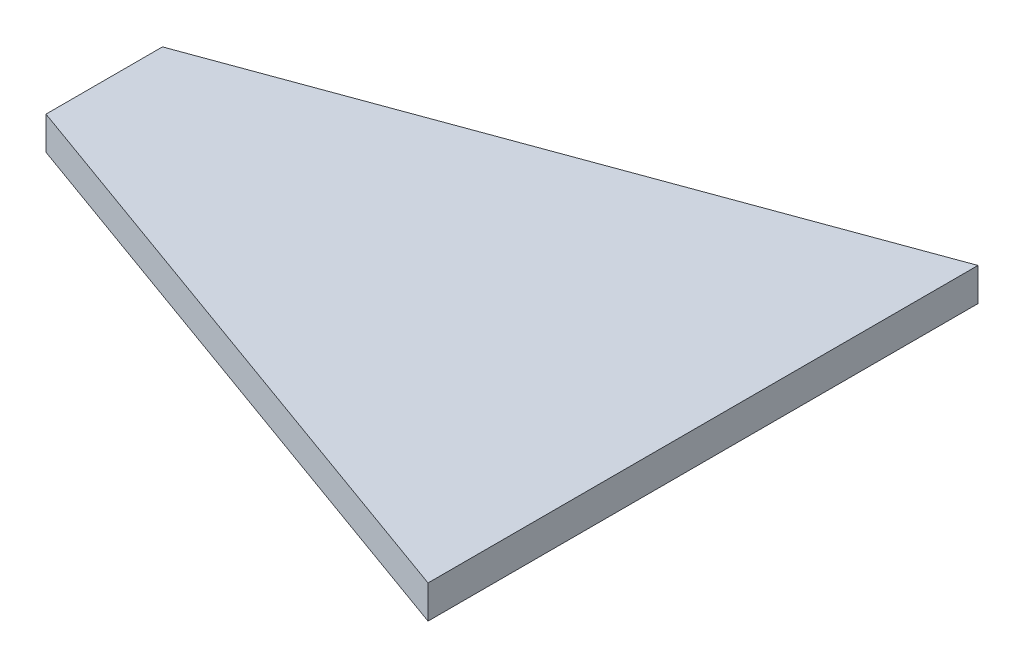
ISO-10303-21;
HEADER;
FILE_DESCRIPTION(('STEP AP214'),'2;1');
FILE_NAME('part.step','',(''),(''),'','','');
FILE_SCHEMA(('AUTOMOTIVE_DESIGN { 1 0 10303 214 1 1 1 1 }'));
ENDSEC;
DATA;
#1=APPLICATION_CONTEXT('core data for automotive mechanical design processes');
#2=APPLICATION_PROTOCOL_DEFINITION('international standard','automotive_design',2000,#1);
#3=PRODUCT_CONTEXT('',#1,'mechanical');
#4=PRODUCT('Part','Part','',(#3));
#5=PRODUCT_RELATED_PRODUCT_CATEGORY('part','',(#4));
#6=PRODUCT_DEFINITION_FORMATION('','',#4);
#7=PRODUCT_DEFINITION_CONTEXT('part definition',#1,'design');
#8=PRODUCT_DEFINITION('design','',#6,#7);
#9=PRODUCT_DEFINITION_SHAPE('','',#8);
#10=(LENGTH_UNIT() NAMED_UNIT(*) SI_UNIT(.MILLI.,.METRE.));
#11=(NAMED_UNIT(*) PLANE_ANGLE_UNIT() SI_UNIT($,.RADIAN.));
#12=(NAMED_UNIT(*) SI_UNIT($,.STERADIAN.) SOLID_ANGLE_UNIT());
#13=UNCERTAINTY_MEASURE_WITH_UNIT(LENGTH_MEASURE(1.E-05),#10,'distance_accuracy_value','');
#14=(GEOMETRIC_REPRESENTATION_CONTEXT(3) GLOBAL_UNCERTAINTY_ASSIGNED_CONTEXT((#13)) GLOBAL_UNIT_ASSIGNED_CONTEXT((#10,
#11,#12)) REPRESENTATION_CONTEXT('',''));
#15=CARTESIAN_POINT('',(0.,0.,0.));
#16=DIRECTION('',(0.,0.,1.));
#17=DIRECTION('',(1.,0.,0.));
#18=AXIS2_PLACEMENT_3D('',#15,#16,#17);
#19=CARTESIAN_POINT('',(0.,0.,0.));
#20=DIRECTION('',(0.,-1.,0.));
#21=DIRECTION('',(0.,0.,-1.));
#22=AXIS2_PLACEMENT_3D('',#19,#20,#21);
#23=PLANE('',#22);
#24=DIRECTION('',(0.,0.,-1.));
#25=VECTOR('',#24,1.);
#26=CARTESIAN_POINT('',(225.762963936357,0.,-89.8891531789288));
#27=LINE('',#26,#25);
#28=CARTESIAN_POINT('',(225.762963936357,0.,90.8821917746876));
#29=VERTEX_POINT('',#28);
#30=CARTESIAN_POINT('',(225.762963936357,0.,-92.0353832616573));
#31=VERTEX_POINT('',#30);
#32=EDGE_CURVE('E178',#29,#31,#27,.T.);
#33=ORIENTED_EDGE('',*,*,#32,.F.);
#34=DIRECTION('',(0.940850297301629,0.,0.338822546574805));
#35=VECTOR('',#34,1.);
#36=CARTESIAN_POINT('',(28.1776426836511,0.,19.7270229825367));
#37=LINE('',#36,#35);
#38=CARTESIAN_POINT('',(27.1858765035133,0.,19.3698644167959));
#39=VERTEX_POINT('',#38);
#40=EDGE_CURVE('E80',#39,#29,#37,.T.);
#41=ORIENTED_EDGE('',*,*,#40,.F.);
#42=DIRECTION('',(0.,0.,1.));
#43=VECTOR('',#42,1.);
#44=CARTESIAN_POINT('',(27.1858765035133,0.,-18.3157475365843));
#45=LINE('',#44,#43);
#46=CARTESIAN_POINT('',(27.1858765035133,0.,-19.3640973934363));
#47=VERTEX_POINT('',#46);
#48=EDGE_CURVE('E182',#47,#39,#45,.T.);
#49=ORIENTED_EDGE('',*,*,#48,.F.);
#50=DIRECTION('',(-0.939090602438919,0.,0.343669667574705));
#51=VECTOR('',#50,1.);
#52=CARTESIAN_POINT('',(28.1703720021512,0.,-19.7243834402427));
#53=LINE('',#52,#51);
#54=EDGE_CURVE('E180',#31,#47,#53,.T.);
#55=ORIENTED_EDGE('',*,*,#54,.F.);
#56=EDGE_LOOP('',(#33,#41,#49,#55));
#57=FACE_BOUND('',#56,.T.);
#58=DIRECTION('',(0.940850297301629,0.,0.338822546574805));
#59=VECTOR('',#58,1.);
#60=CARTESIAN_POINT('',(28.6858765035133,0.,18.3157475365843));
#61=LINE('',#60,#59);
#62=CARTESIAN_POINT('',(28.6858765035133,0.,18.3157475365843));
#63=VERTEX_POINT('',#62);
#64=CARTESIAN_POINT('',(224.262963936357,0.,88.747703614752));
#65=VERTEX_POINT('',#64);
#66=EDGE_CURVE('E152',#63,#65,#61,.T.);
#67=ORIENTED_EDGE('',*,*,#66,.T.);
#68=DIRECTION('',(0.,0.,-1.));
#69=VECTOR('',#68,1.);
#70=CARTESIAN_POINT('',(224.262963936357,0.,-89.8891531789288));
#71=LINE('',#70,#69);
#72=CARTESIAN_POINT('',(224.262963936357,0.,-89.8891531789288));
#73=VERTEX_POINT('',#72);
#74=EDGE_CURVE('E72',#65,#73,#71,.T.);
#75=ORIENTED_EDGE('',*,*,#74,.T.);
#76=DIRECTION('',(-0.939090602438919,0.,0.343669667574705));
#77=VECTOR('',#76,1.);
#78=CARTESIAN_POINT('',(28.6858765035133,0.,-18.3157475365843));
#79=LINE('',#78,#77);
#80=CARTESIAN_POINT('',(28.6858765035133,0.,-18.3157475365843));
#81=VERTEX_POINT('',#80);
#82=EDGE_CURVE('E163',#73,#81,#79,.T.);
#83=ORIENTED_EDGE('',*,*,#82,.T.);
#84=DIRECTION('',(0.,0.,1.));
#85=VECTOR('',#84,1.);
#86=CARTESIAN_POINT('',(28.6858765035133,0.,-18.3157475365843));
#87=LINE('',#86,#85);
#88=EDGE_CURVE('E166',#81,#63,#87,.T.);
#89=ORIENTED_EDGE('',*,*,#88,.T.);
#90=EDGE_LOOP('',(#67,#75,#83,#89));
#91=FACE_BOUND('',#90,.T.);
#92=ADVANCED_FACE('F57',(#57,#91),#23,.T.);
#93=CARTESIAN_POINT('',(225.762963936357,10.,-89.8891531789288));
#94=DIRECTION('',(-1.,0.,0.));
#95=DIRECTION('',(0.,0.,1.));
#96=AXIS2_PLACEMENT_3D('',#93,#94,#95);
#97=PLANE('',#96);
#98=ORIENTED_EDGE('',*,*,#32,.T.);
#99=DIRECTION('',(0.,-1.,0.));
#100=VECTOR('',#99,1.);
#101=CARTESIAN_POINT('',(225.762963936357,10.,-92.0353832616573));
#102=LINE('',#101,#100);
#103=CARTESIAN_POINT('',(225.762963936357,11.,-92.0353832616573));
#104=VERTEX_POINT('',#103);
#105=EDGE_CURVE('E12',#104,#31,#102,.T.);
#106=ORIENTED_EDGE('',*,*,#105,.F.);
#107=DIRECTION('',(0.,0.,-1.));
#108=VECTOR('',#107,1.);
#109=CARTESIAN_POINT('',(225.762963936357,11.,90.8821917746876));
#110=LINE('',#109,#108);
#111=CARTESIAN_POINT('',(225.762963936357,11.,90.8821917746876));
#112=VERTEX_POINT('',#111);
#113=EDGE_CURVE('E134',#112,#104,#110,.T.);
#114=ORIENTED_EDGE('',*,*,#113,.F.);
#115=DIRECTION('',(0.,-1.,0.));
#116=VECTOR('',#115,1.);
#117=CARTESIAN_POINT('',(225.762963936357,10.,90.8821917746876));
#118=LINE('',#117,#116);
#119=EDGE_CURVE('E123',#112,#29,#118,.T.);
#120=ORIENTED_EDGE('',*,*,#119,.T.);
#121=EDGE_LOOP('',(#98,#106,#114,#120));
#122=FACE_BOUND('',#121,.T.);
#123=ADVANCED_FACE('F59',(#122),#97,.F.);
#124=CARTESIAN_POINT('',(28.1703720021512,10.,-19.7243834402427));
#125=DIRECTION('',(0.343669667574705,0.,0.939090602438919));
#126=DIRECTION('',(0.939090602438919,0.,-0.343669667574705));
#127=AXIS2_PLACEMENT_3D('',#124,#125,#126);
#128=PLANE('',#127);
#129=ORIENTED_EDGE('',*,*,#54,.T.);
#130=DIRECTION('',(0.,-1.,0.));
#131=VECTOR('',#130,1.);
#132=CARTESIAN_POINT('',(27.1858765035133,10.,-19.3640973934363));
#133=LINE('',#132,#131);
#134=CARTESIAN_POINT('',(27.1858765035133,11.,-19.3640973934363));
#135=VERTEX_POINT('',#134);
#136=EDGE_CURVE('E65',#135,#47,#133,.T.);
#137=ORIENTED_EDGE('',*,*,#136,.F.);
#138=DIRECTION('',(-0.939090602438919,0.,0.343669667574705));
#139=VECTOR('',#138,1.);
#140=CARTESIAN_POINT('',(225.762963936357,11.,-92.0353832616573));
#141=LINE('',#140,#139);
#142=EDGE_CURVE('E138',#104,#135,#141,.T.);
#143=ORIENTED_EDGE('',*,*,#142,.F.);
#144=ORIENTED_EDGE('',*,*,#105,.T.);
#145=EDGE_LOOP('',(#129,#137,#143,#144));
#146=FACE_BOUND('',#145,.T.);
#147=ADVANCED_FACE('F192',(#146),#128,.F.);
#148=CARTESIAN_POINT('',(27.1858765035133,10.,-18.3157475365843));
#149=DIRECTION('',(1.,0.,0.));
#150=DIRECTION('',(0.,0.,-1.));
#151=AXIS2_PLACEMENT_3D('',#148,#149,#150);
#152=PLANE('',#151);
#153=ORIENTED_EDGE('',*,*,#48,.T.);
#154=DIRECTION('',(0.,-1.,0.));
#155=VECTOR('',#154,1.);
#156=CARTESIAN_POINT('',(27.1858765035133,10.,19.3698644167959));
#157=LINE('',#156,#155);
#158=CARTESIAN_POINT('',(27.1858765035133,11.,19.3698644167959));
#159=VERTEX_POINT('',#158);
#160=EDGE_CURVE('E131',#159,#39,#157,.T.);
#161=ORIENTED_EDGE('',*,*,#160,.F.);
#162=DIRECTION('',(0.,0.,1.));
#163=VECTOR('',#162,1.);
#164=CARTESIAN_POINT('',(27.1858765035133,11.,-19.3640973934363));
#165=LINE('',#164,#163);
#166=EDGE_CURVE('E143',#135,#159,#165,.T.);
#167=ORIENTED_EDGE('',*,*,#166,.F.);
#168=ORIENTED_EDGE('',*,*,#136,.T.);
#169=EDGE_LOOP('',(#153,#161,#167,#168));
#170=FACE_BOUND('',#169,.T.);
#171=ADVANCED_FACE('F188',(#170),#152,.F.);
#172=CARTESIAN_POINT('',(28.1776426836511,10.,19.7270229825367));
#173=DIRECTION('',(0.338822546574805,0.,-0.940850297301629));
#174=DIRECTION('',(-0.940850297301629,0.,-0.338822546574805));
#175=AXIS2_PLACEMENT_3D('',#172,#173,#174);
#176=PLANE('',#175);
#177=ORIENTED_EDGE('',*,*,#40,.T.);
#178=ORIENTED_EDGE('',*,*,#119,.F.);
#179=DIRECTION('',(0.940850297301629,0.,0.338822546574805));
#180=VECTOR('',#179,1.);
#181=CARTESIAN_POINT('',(27.1858765035133,11.,19.3698644167959));
#182=LINE('',#181,#180);
#183=EDGE_CURVE('E127',#159,#112,#182,.T.);
#184=ORIENTED_EDGE('',*,*,#183,.F.);
#185=ORIENTED_EDGE('',*,*,#160,.T.);
#186=EDGE_LOOP('',(#177,#178,#184,#185));
#187=FACE_BOUND('',#186,.T.);
#188=ADVANCED_FACE('F125',(#187),#176,.F.);
#189=CARTESIAN_POINT('',(224.262963936357,10.,-89.8891531789288));
#190=DIRECTION('',(-1.,0.,0.));
#191=DIRECTION('',(0.,0.,1.));
#192=AXIS2_PLACEMENT_3D('',#189,#190,#191);
#193=PLANE('',#192);
#194=ORIENTED_EDGE('',*,*,#74,.F.);
#195=DIRECTION('',(0.,-1.,0.));
#196=VECTOR('',#195,1.);
#197=CARTESIAN_POINT('',(224.262963936357,10.,88.747703614752));
#198=LINE('',#197,#196);
#199=CARTESIAN_POINT('',(224.262963936357,10.,88.747703614752));
#200=VERTEX_POINT('',#199);
#201=EDGE_CURVE('E161',#200,#65,#198,.T.);
#202=ORIENTED_EDGE('',*,*,#201,.F.);
#203=DIRECTION('',(0.,0.,-1.));
#204=VECTOR('',#203,1.);
#205=CARTESIAN_POINT('',(224.262963936357,10.,-89.8891531789288));
#206=LINE('',#205,#204);
#207=CARTESIAN_POINT('',(224.262963936357,10.,-89.8891531789288));
#208=VERTEX_POINT('',#207);
#209=EDGE_CURVE('E148',#200,#208,#206,.T.);
#210=ORIENTED_EDGE('',*,*,#209,.T.);
#211=DIRECTION('',(0.,-1.,0.));
#212=VECTOR('',#211,1.);
#213=CARTESIAN_POINT('',(224.262963936357,10.,-89.8891531789288));
#214=LINE('',#213,#212);
#215=EDGE_CURVE('E176',#208,#73,#214,.T.);
#216=ORIENTED_EDGE('',*,*,#215,.T.);
#217=EDGE_LOOP('',(#194,#202,#210,#216));
#218=FACE_BOUND('',#217,.T.);
#219=ADVANCED_FACE('F205',(#218),#193,.T.);
#220=CARTESIAN_POINT('',(28.6858765035133,10.,-18.3157475365843));
#221=DIRECTION('',(0.343669667574705,0.,0.939090602438919));
#222=DIRECTION('',(0.939090602438919,0.,-0.343669667574705));
#223=AXIS2_PLACEMENT_3D('',#220,#221,#222);
#224=PLANE('',#223);
#225=ORIENTED_EDGE('',*,*,#82,.F.);
#226=ORIENTED_EDGE('',*,*,#215,.F.);
#227=DIRECTION('',(-0.939090602438919,0.,0.343669667574705));
#228=VECTOR('',#227,1.);
#229=CARTESIAN_POINT('',(28.6858765035133,10.,-18.3157475365843));
#230=LINE('',#229,#228);
#231=CARTESIAN_POINT('',(28.6858765035133,10.,-18.3157475365843));
#232=VERTEX_POINT('',#231);
#233=EDGE_CURVE('E151',#208,#232,#230,.T.);
#234=ORIENTED_EDGE('',*,*,#233,.T.);
#235=DIRECTION('',(0.,-1.,0.));
#236=VECTOR('',#235,1.);
#237=CARTESIAN_POINT('',(28.6858765035133,10.,-18.3157475365843));
#238=LINE('',#237,#236);
#239=EDGE_CURVE('E174',#232,#81,#238,.T.);
#240=ORIENTED_EDGE('',*,*,#239,.T.);
#241=EDGE_LOOP('',(#225,#226,#234,#240));
#242=FACE_BOUND('',#241,.T.);
#243=ADVANCED_FACE('F211',(#242),#224,.T.);
#244=CARTESIAN_POINT('',(28.6858765035133,10.,-18.3157475365843));
#245=DIRECTION('',(1.,0.,0.));
#246=DIRECTION('',(0.,0.,-1.));
#247=AXIS2_PLACEMENT_3D('',#244,#245,#246);
#248=PLANE('',#247);
#249=ORIENTED_EDGE('',*,*,#88,.F.);
#250=ORIENTED_EDGE('',*,*,#239,.F.);
#251=DIRECTION('',(0.,0.,1.));
#252=VECTOR('',#251,1.);
#253=CARTESIAN_POINT('',(28.6858765035133,10.,-18.3157475365843));
#254=LINE('',#253,#252);
#255=CARTESIAN_POINT('',(28.6858765035133,10.,18.3157475365843));
#256=VERTEX_POINT('',#255);
#257=EDGE_CURVE('E155',#232,#256,#254,.T.);
#258=ORIENTED_EDGE('',*,*,#257,.T.);
#259=DIRECTION('',(0.,-1.,0.));
#260=VECTOR('',#259,1.);
#261=CARTESIAN_POINT('',(28.6858765035133,10.,18.3157475365843));
#262=LINE('',#261,#260);
#263=EDGE_CURVE('E172',#256,#63,#262,.T.);
#264=ORIENTED_EDGE('',*,*,#263,.T.);
#265=EDGE_LOOP('',(#249,#250,#258,#264));
#266=FACE_BOUND('',#265,.T.);
#267=ADVANCED_FACE('F215',(#266),#248,.T.);
#268=CARTESIAN_POINT('',(28.6858765035133,10.,18.3157475365843));
#269=DIRECTION('',(0.338822546574805,0.,-0.940850297301629));
#270=DIRECTION('',(-0.940850297301629,0.,-0.338822546574805));
#271=AXIS2_PLACEMENT_3D('',#268,#269,#270);
#272=PLANE('',#271);
#273=ORIENTED_EDGE('',*,*,#66,.F.);
#274=ORIENTED_EDGE('',*,*,#263,.F.);
#275=DIRECTION('',(0.940850297301629,0.,0.338822546574805));
#276=VECTOR('',#275,1.);
#277=CARTESIAN_POINT('',(28.6858765035133,10.,18.3157475365843));
#278=LINE('',#277,#276);
#279=EDGE_CURVE('E158',#256,#200,#278,.T.);
#280=ORIENTED_EDGE('',*,*,#279,.T.);
#281=ORIENTED_EDGE('',*,*,#201,.T.);
#282=EDGE_LOOP('',(#273,#274,#280,#281));
#283=FACE_BOUND('',#282,.T.);
#284=ADVANCED_FACE('F220',(#283),#272,.T.);
#285=CARTESIAN_POINT('',(0.,10.,0.));
#286=DIRECTION('',(0.,1.,0.));
#287=DIRECTION('',(0.,0.,1.));
#288=AXIS2_PLACEMENT_3D('',#285,#286,#287);
#289=PLANE('',#288);
#290=ORIENTED_EDGE('',*,*,#209,.F.);
#291=ORIENTED_EDGE('',*,*,#279,.F.);
#292=ORIENTED_EDGE('',*,*,#257,.F.);
#293=ORIENTED_EDGE('',*,*,#233,.F.);
#294=EDGE_LOOP('',(#290,#291,#292,#293));
#295=FACE_BOUND('',#294,.T.);
#296=ADVANCED_FACE('F226',(#295),#289,.F.);
#297=CARTESIAN_POINT('',(0.,11.,0.));
#298=DIRECTION('',(0.,1.,0.));
#299=DIRECTION('',(0.,0.,1.));
#300=AXIS2_PLACEMENT_3D('',#297,#298,#299);
#301=PLANE('',#300);
#302=ORIENTED_EDGE('',*,*,#183,.T.);
#303=ORIENTED_EDGE('',*,*,#113,.T.);
#304=ORIENTED_EDGE('',*,*,#142,.T.);
#305=ORIENTED_EDGE('',*,*,#166,.T.);
#306=EDGE_LOOP('',(#302,#303,#304,#305));
#307=FACE_BOUND('',#306,.T.);
#308=ADVANCED_FACE('F141',(#307),#301,.T.);
#309=CLOSED_SHELL('',(#92,#123,#147,#171,#188,#219,#243,#267,#284,#296,#308));
#310=MANIFOLD_SOLID_BREP('B2',#309);
#311=ADVANCED_BREP_SHAPE_REPRESENTATION('',(#18,#310),#14);
#312=SHAPE_DEFINITION_REPRESENTATION(#9,#311);
ENDSEC;
END-ISO-10303-21;
